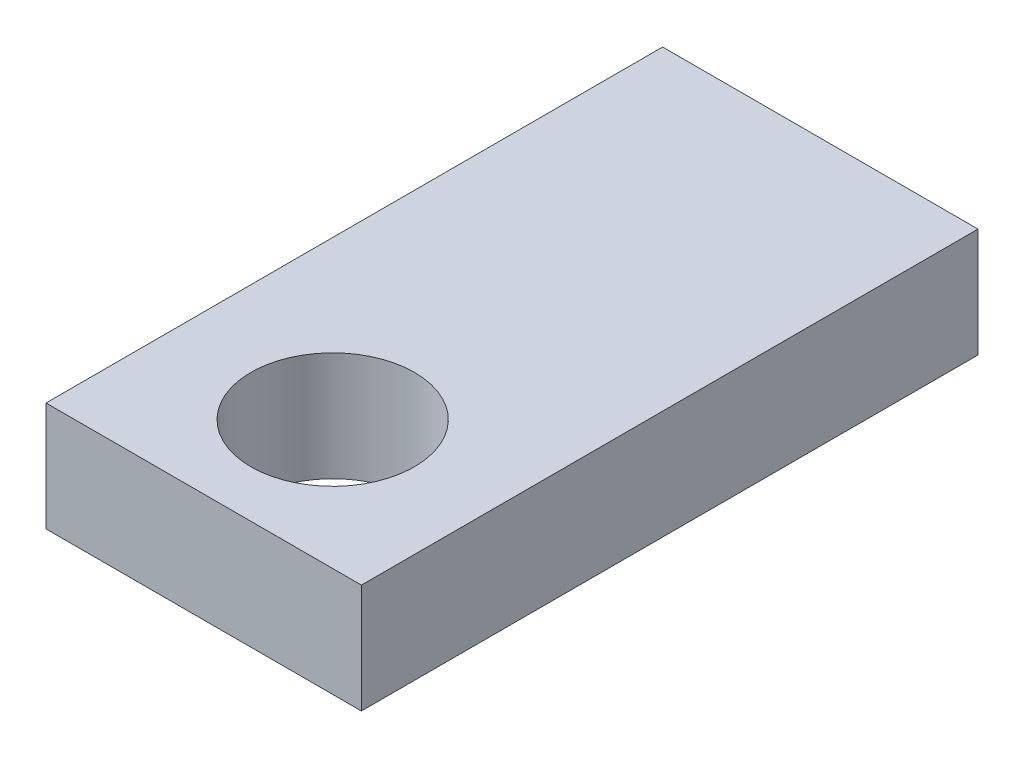
ISO-10303-21;
HEADER;
FILE_DESCRIPTION(('STEP AP214'),'2;1');
FILE_NAME('part.step','',(''),(''),'','','');
FILE_SCHEMA(('AUTOMOTIVE_DESIGN { 1 0 10303 214 1 1 1 1 }'));
ENDSEC;
DATA;
#1=APPLICATION_CONTEXT('core data for automotive mechanical design processes');
#2=APPLICATION_PROTOCOL_DEFINITION('international standard','automotive_design',2000,#1);
#3=PRODUCT_CONTEXT('',#1,'mechanical');
#4=PRODUCT('Part','Part','',(#3));
#5=PRODUCT_RELATED_PRODUCT_CATEGORY('part','',(#4));
#6=PRODUCT_DEFINITION_FORMATION('','',#4);
#7=PRODUCT_DEFINITION_CONTEXT('part definition',#1,'design');
#8=PRODUCT_DEFINITION('design','',#6,#7);
#9=PRODUCT_DEFINITION_SHAPE('','',#8);
#10=(LENGTH_UNIT() NAMED_UNIT(*) SI_UNIT(.MILLI.,.METRE.));
#11=(NAMED_UNIT(*) PLANE_ANGLE_UNIT() SI_UNIT($,.RADIAN.));
#12=(NAMED_UNIT(*) SI_UNIT($,.STERADIAN.) SOLID_ANGLE_UNIT());
#13=UNCERTAINTY_MEASURE_WITH_UNIT(LENGTH_MEASURE(1.E-05),#10,'distance_accuracy_value','');
#14=(GEOMETRIC_REPRESENTATION_CONTEXT(3) GLOBAL_UNCERTAINTY_ASSIGNED_CONTEXT((#13)) GLOBAL_UNIT_ASSIGNED_CONTEXT((#10,
#11,#12)) REPRESENTATION_CONTEXT('',''));
#15=CARTESIAN_POINT('',(0.,0.,0.));
#16=DIRECTION('',(0.,0.,1.));
#17=DIRECTION('',(1.,0.,0.));
#18=AXIS2_PLACEMENT_3D('',#15,#16,#17);
#19=CARTESIAN_POINT('',(-11.5687228073918,8.,0.));
#20=DIRECTION('',(1.,0.,0.));
#21=DIRECTION('',(0.,0.,-1.));
#22=AXIS2_PLACEMENT_3D('',#19,#20,#21);
#23=PLANE('',#22);
#24=DIRECTION('',(0.,0.,1.));
#25=VECTOR('',#24,1.);
#26=CARTESIAN_POINT('',(-11.5687228073918,0.,0.));
#27=LINE('',#26,#25);
#28=CARTESIAN_POINT('',(-11.5687228073918,0.,-27.7714433138588));
#29=VERTEX_POINT('',#28);
#30=CARTESIAN_POINT('',(-11.5687228073918,0.,17.4647043689874));
#31=VERTEX_POINT('',#30);
#32=EDGE_CURVE('E97',#29,#31,#27,.T.);
#33=ORIENTED_EDGE('',*,*,#32,.T.);
#34=DIRECTION('',(0.,-1.,0.));
#35=VECTOR('',#34,1.);
#36=CARTESIAN_POINT('',(-11.5687228073918,8.,17.4647043689874));
#37=LINE('',#36,#35);
#38=CARTESIAN_POINT('',(-11.5687228073918,8.,17.4647043689874));
#39=VERTEX_POINT('',#38);
#40=EDGE_CURVE('E11',#39,#31,#37,.T.);
#41=ORIENTED_EDGE('',*,*,#40,.F.);
#42=DIRECTION('',(0.,0.,1.));
#43=VECTOR('',#42,1.);
#44=CARTESIAN_POINT('',(-11.5687228073918,8.,0.));
#45=LINE('',#44,#43);
#46=CARTESIAN_POINT('',(-11.5687228073918,8.,-27.7714433138588));
#47=VERTEX_POINT('',#46);
#48=EDGE_CURVE('E105',#47,#39,#45,.T.);
#49=ORIENTED_EDGE('',*,*,#48,.F.);
#50=DIRECTION('',(0.,-1.,0.));
#51=VECTOR('',#50,1.);
#52=CARTESIAN_POINT('',(-11.5687228073918,8.,-27.7714433138588));
#53=LINE('',#52,#51);
#54=EDGE_CURVE('E93',#47,#29,#53,.T.);
#55=ORIENTED_EDGE('',*,*,#54,.T.);
#56=EDGE_LOOP('',(#33,#41,#49,#55));
#57=FACE_BOUND('',#56,.T.);
#58=ADVANCED_FACE('F35',(#57),#23,.F.);
#59=CARTESIAN_POINT('',(0.,8.,17.4647043689874));
#60=DIRECTION('',(0.,0.,-1.));
#61=DIRECTION('',(-1.,0.,0.));
#62=AXIS2_PLACEMENT_3D('',#59,#60,#61);
#63=PLANE('',#62);
#64=DIRECTION('',(1.,0.,0.));
#65=VECTOR('',#64,1.);
#66=CARTESIAN_POINT('',(0.,0.,17.4647043689874));
#67=LINE('',#66,#65);
#68=CARTESIAN_POINT('',(11.5687228073918,0.,17.4647043689874));
#69=VERTEX_POINT('',#68);
#70=EDGE_CURVE('E63',#31,#69,#67,.T.);
#71=ORIENTED_EDGE('',*,*,#70,.T.);
#72=DIRECTION('',(0.,-1.,0.));
#73=VECTOR('',#72,1.);
#74=CARTESIAN_POINT('',(11.5687228073918,8.,17.4647043689874));
#75=LINE('',#74,#73);
#76=CARTESIAN_POINT('',(11.5687228073918,8.,17.4647043689874));
#77=VERTEX_POINT('',#76);
#78=EDGE_CURVE('E44',#77,#69,#75,.T.);
#79=ORIENTED_EDGE('',*,*,#78,.F.);
#80=DIRECTION('',(1.,0.,0.));
#81=VECTOR('',#80,1.);
#82=CARTESIAN_POINT('',(0.,8.,17.4647043689874));
#83=LINE('',#82,#81);
#84=EDGE_CURVE('E52',#39,#77,#83,.T.);
#85=ORIENTED_EDGE('',*,*,#84,.F.);
#86=ORIENTED_EDGE('',*,*,#40,.T.);
#87=EDGE_LOOP('',(#71,#79,#85,#86));
#88=FACE_BOUND('',#87,.T.);
#89=ADVANCED_FACE('F113',(#88),#63,.F.);
#90=CARTESIAN_POINT('',(0.,8.,8.00235768739895));
#91=DIRECTION('',(0.,-1.,0.));
#92=DIRECTION('',(0.,0.,-1.));
#93=AXIS2_PLACEMENT_3D('',#90,#91,#92);
#94=CYLINDRICAL_SURFACE('',#93,5.99999999999993);
#95=CARTESIAN_POINT('',(0.,8.,8.00235768739895));
#96=DIRECTION('',(0.,1.,0.));
#97=DIRECTION('',(0.,0.,1.));
#98=AXIS2_PLACEMENT_3D('',#95,#96,#97);
#99=CIRCLE('',#98,5.99999999999993);
#100=CARTESIAN_POINT('',(0.,8.,14.0023576873989));
#101=VERTEX_POINT('',#100);
#102=EDGE_CURVE('E84',#101,#101,#99,.T.);
#103=ORIENTED_EDGE('',*,*,#102,.T.);
#104=EDGE_LOOP('',(#103));
#105=FACE_BOUND('',#104,.T.);
#106=CARTESIAN_POINT('',(0.,0.,8.00235768739895));
#107=DIRECTION('',(0.,1.,0.));
#108=DIRECTION('',(0.,0.,1.));
#109=AXIS2_PLACEMENT_3D('',#106,#107,#108);
#110=CIRCLE('',#109,5.99999999999993);
#111=CARTESIAN_POINT('',(0.,0.,14.0023576873989));
#112=VERTEX_POINT('',#111);
#113=EDGE_CURVE('E92',#112,#112,#110,.T.);
#114=ORIENTED_EDGE('',*,*,#113,.F.);
#115=EDGE_LOOP('',(#114));
#116=FACE_BOUND('',#115,.T.);
#117=ADVANCED_FACE('F37',(#105,#116),#94,.F.);
#118=CARTESIAN_POINT('',(11.5687228073918,8.,0.));
#119=DIRECTION('',(1.,0.,0.));
#120=DIRECTION('',(0.,0.,-1.));
#121=AXIS2_PLACEMENT_3D('',#118,#119,#120);
#122=PLANE('',#121);
#123=DIRECTION('',(0.,0.,1.));
#124=VECTOR('',#123,1.);
#125=CARTESIAN_POINT('',(11.5687228073918,0.,0.));
#126=LINE('',#125,#124);
#127=CARTESIAN_POINT('',(11.5687228073918,0.,-27.7714433138588));
#128=VERTEX_POINT('',#127);
#129=EDGE_CURVE('E78',#128,#69,#126,.T.);
#130=ORIENTED_EDGE('',*,*,#129,.F.);
#131=DIRECTION('',(0.,-1.,0.));
#132=VECTOR('',#131,1.);
#133=CARTESIAN_POINT('',(11.5687228073918,8.,-27.7714433138588));
#134=LINE('',#133,#132);
#135=CARTESIAN_POINT('',(11.5687228073918,8.,-27.7714433138588));
#136=VERTEX_POINT('',#135);
#137=EDGE_CURVE('E81',#136,#128,#134,.T.);
#138=ORIENTED_EDGE('',*,*,#137,.F.);
#139=DIRECTION('',(0.,0.,1.));
#140=VECTOR('',#139,1.);
#141=CARTESIAN_POINT('',(11.5687228073918,8.,0.));
#142=LINE('',#141,#140);
#143=EDGE_CURVE('E69',#136,#77,#142,.T.);
#144=ORIENTED_EDGE('',*,*,#143,.T.);
#145=ORIENTED_EDGE('',*,*,#78,.T.);
#146=EDGE_LOOP('',(#130,#138,#144,#145));
#147=FACE_BOUND('',#146,.T.);
#148=ADVANCED_FACE('F80',(#147),#122,.T.);
#149=CARTESIAN_POINT('',(0.,8.,0.));
#150=DIRECTION('',(0.,1.,0.));
#151=DIRECTION('',(0.,0.,1.));
#152=AXIS2_PLACEMENT_3D('',#149,#150,#151);
#153=PLANE('',#152);
#154=ORIENTED_EDGE('',*,*,#102,.F.);
#155=EDGE_LOOP('',(#154));
#156=FACE_BOUND('',#155,.T.);
#157=ORIENTED_EDGE('',*,*,#143,.F.);
#158=DIRECTION('',(1.,0.,0.));
#159=VECTOR('',#158,1.);
#160=CARTESIAN_POINT('',(-11.5687228073918,8.,-27.7714433138588));
#161=LINE('',#160,#159);
#162=EDGE_CURVE('E91',#47,#136,#161,.T.);
#163=ORIENTED_EDGE('',*,*,#162,.F.);
#164=ORIENTED_EDGE('',*,*,#48,.T.);
#165=ORIENTED_EDGE('',*,*,#84,.T.);
#166=EDGE_LOOP('',(#157,#163,#164,#165));
#167=FACE_BOUND('',#166,.T.);
#168=ADVANCED_FACE('F116',(#156,#167),#153,.T.);
#169=CARTESIAN_POINT('',(0.,0.,0.));
#170=DIRECTION('',(0.,1.,0.));
#171=DIRECTION('',(0.,0.,1.));
#172=AXIS2_PLACEMENT_3D('',#169,#170,#171);
#173=PLANE('',#172);
#174=ORIENTED_EDGE('',*,*,#113,.T.);
#175=EDGE_LOOP('',(#174));
#176=FACE_BOUND('',#175,.T.);
#177=ORIENTED_EDGE('',*,*,#32,.F.);
#178=DIRECTION('',(1.,0.,0.));
#179=VECTOR('',#178,1.);
#180=CARTESIAN_POINT('',(-11.5687228073918,0.,-27.7714433138588));
#181=LINE('',#180,#179);
#182=EDGE_CURVE('E90',#29,#128,#181,.T.);
#183=ORIENTED_EDGE('',*,*,#182,.T.);
#184=ORIENTED_EDGE('',*,*,#129,.T.);
#185=ORIENTED_EDGE('',*,*,#70,.F.);
#186=EDGE_LOOP('',(#177,#183,#184,#185));
#187=FACE_BOUND('',#186,.T.);
#188=ADVANCED_FACE('F95',(#176,#187),#173,.F.);
#189=CARTESIAN_POINT('',(-11.5687228073918,8.,-27.7714433138588));
#190=DIRECTION('',(0.,0.,-1.));
#191=DIRECTION('',(-1.,0.,0.));
#192=AXIS2_PLACEMENT_3D('',#189,#190,#191);
#193=PLANE('',#192);
#194=ORIENTED_EDGE('',*,*,#182,.F.);
#195=ORIENTED_EDGE('',*,*,#54,.F.);
#196=ORIENTED_EDGE('',*,*,#162,.T.);
#197=ORIENTED_EDGE('',*,*,#137,.T.);
#198=EDGE_LOOP('',(#194,#195,#196,#197));
#199=FACE_BOUND('',#198,.T.);
#200=ADVANCED_FACE('F88',(#199),#193,.T.);
#201=CLOSED_SHELL('',(#58,#89,#117,#148,#168,#188,#200));
#202=MANIFOLD_SOLID_BREP('B2',#201);
#203=ADVANCED_BREP_SHAPE_REPRESENTATION('',(#18,#202),#14);
#204=SHAPE_DEFINITION_REPRESENTATION(#9,#203);
ENDSEC;
END-ISO-10303-21;
